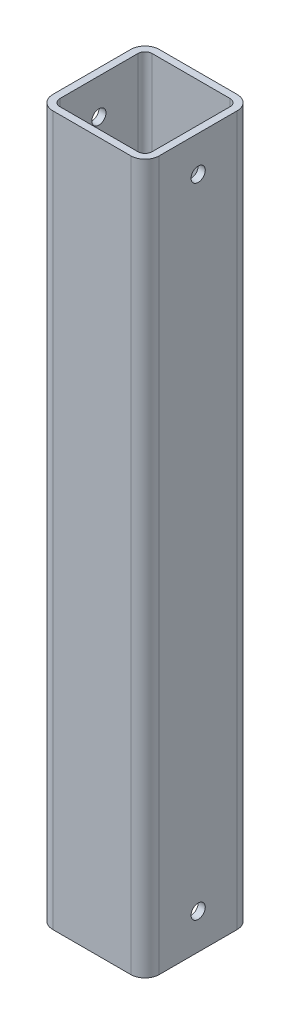
ISO-10303-21;
HEADER;
FILE_DESCRIPTION(('STEP AP214'),'2;1');
FILE_NAME('part.step','',(''),(''),'','','');
FILE_SCHEMA(('AUTOMOTIVE_DESIGN { 1 0 10303 214 1 1 1 1 }'));
ENDSEC;
DATA;
#1=APPLICATION_CONTEXT('core data for automotive mechanical design processes');
#2=APPLICATION_PROTOCOL_DEFINITION('international standard','automotive_design',2000,#1);
#3=PRODUCT_CONTEXT('',#1,'mechanical');
#4=PRODUCT('Part','Part','',(#3));
#5=PRODUCT_RELATED_PRODUCT_CATEGORY('part','',(#4));
#6=PRODUCT_DEFINITION_FORMATION('','',#4);
#7=PRODUCT_DEFINITION_CONTEXT('part definition',#1,'design');
#8=PRODUCT_DEFINITION('design','',#6,#7);
#9=PRODUCT_DEFINITION_SHAPE('','',#8);
#10=(LENGTH_UNIT() NAMED_UNIT(*) SI_UNIT(.MILLI.,.METRE.));
#11=(NAMED_UNIT(*) PLANE_ANGLE_UNIT() SI_UNIT($,.RADIAN.));
#12=(NAMED_UNIT(*) SI_UNIT($,.STERADIAN.) SOLID_ANGLE_UNIT());
#13=UNCERTAINTY_MEASURE_WITH_UNIT(LENGTH_MEASURE(1.E-05),#10,'distance_accuracy_value','');
#14=(GEOMETRIC_REPRESENTATION_CONTEXT(3) GLOBAL_UNCERTAINTY_ASSIGNED_CONTEXT((#13)) GLOBAL_UNIT_ASSIGNED_CONTEXT((#10,
#11,#12)) REPRESENTATION_CONTEXT('',''));
#15=CARTESIAN_POINT('',(0.,0.,0.));
#16=DIRECTION('',(0.,0.,1.));
#17=DIRECTION('',(1.,0.,0.));
#18=AXIS2_PLACEMENT_3D('',#15,#16,#17);
#19=CARTESIAN_POINT('',(-11.,100.,11.));
#20=DIRECTION('',(0.,-1.,0.));
#21=DIRECTION('',(0.,0.,-1.));
#22=AXIS2_PLACEMENT_3D('',#19,#20,#21);
#23=PLANE('',#22);
#24=CARTESIAN_POINT('',(-11.,100.,11.));
#25=DIRECTION('',(0.,1.,0.));
#26=DIRECTION('',(0.,0.,-1.));
#27=AXIS2_PLACEMENT_3D('',#24,#25,#26);
#28=CIRCLE('',#27,4.);
#29=CARTESIAN_POINT('',(-15.,100.,11.));
#30=VERTEX_POINT('',#29);
#31=CARTESIAN_POINT('',(-11.,100.,15.));
#32=VERTEX_POINT('',#31);
#33=EDGE_CURVE('E217',#30,#32,#28,.T.);
#34=ORIENTED_EDGE('',*,*,#33,.T.);
#35=DIRECTION('',(1.,0.,0.));
#36=VECTOR('',#35,1.);
#37=CARTESIAN_POINT('',(-11.,100.,15.));
#38=LINE('',#37,#36);
#39=CARTESIAN_POINT('',(11.,100.,15.));
#40=VERTEX_POINT('',#39);
#41=EDGE_CURVE('E220',#32,#40,#38,.T.);
#42=ORIENTED_EDGE('',*,*,#41,.T.);
#43=CARTESIAN_POINT('',(11.,100.,11.));
#44=DIRECTION('',(0.,1.,0.));
#45=DIRECTION('',(0.,0.,1.));
#46=AXIS2_PLACEMENT_3D('',#43,#44,#45);
#47=CIRCLE('',#46,4.);
#48=CARTESIAN_POINT('',(15.,100.,11.));
#49=VERTEX_POINT('',#48);
#50=EDGE_CURVE('E223',#40,#49,#47,.T.);
#51=ORIENTED_EDGE('',*,*,#50,.T.);
#52=DIRECTION('',(0.,0.,-1.));
#53=VECTOR('',#52,1.);
#54=CARTESIAN_POINT('',(15.,100.,11.));
#55=LINE('',#54,#53);
#56=CARTESIAN_POINT('',(15.,100.,-11.));
#57=VERTEX_POINT('',#56);
#58=EDGE_CURVE('E225',#49,#57,#55,.T.);
#59=ORIENTED_EDGE('',*,*,#58,.T.);
#60=CARTESIAN_POINT('',(11.,100.,-11.));
#61=DIRECTION('',(0.,1.,0.));
#62=DIRECTION('',(0.,0.,-1.));
#63=AXIS2_PLACEMENT_3D('',#60,#61,#62);
#64=CIRCLE('',#63,4.);
#65=CARTESIAN_POINT('',(11.,100.,-15.));
#66=VERTEX_POINT('',#65);
#67=EDGE_CURVE('E227',#57,#66,#64,.T.);
#68=ORIENTED_EDGE('',*,*,#67,.T.);
#69=DIRECTION('',(-1.,0.,0.));
#70=VECTOR('',#69,1.);
#71=CARTESIAN_POINT('',(-11.,100.,-15.));
#72=LINE('',#71,#70);
#73=CARTESIAN_POINT('',(-11.,100.,-15.));
#74=VERTEX_POINT('',#73);
#75=EDGE_CURVE('E229',#66,#74,#72,.T.);
#76=ORIENTED_EDGE('',*,*,#75,.T.);
#77=CARTESIAN_POINT('',(-11.,100.,-11.));
#78=DIRECTION('',(0.,1.,0.));
#79=DIRECTION('',(0.,0.,-1.));
#80=AXIS2_PLACEMENT_3D('',#77,#78,#79);
#81=CIRCLE('',#80,4.);
#82=CARTESIAN_POINT('',(-15.,100.,-11.));
#83=VERTEX_POINT('',#82);
#84=EDGE_CURVE('E231',#74,#83,#81,.T.);
#85=ORIENTED_EDGE('',*,*,#84,.T.);
#86=DIRECTION('',(0.,0.,1.));
#87=VECTOR('',#86,1.);
#88=CARTESIAN_POINT('',(-15.,100.,11.));
#89=LINE('',#88,#87);
#90=EDGE_CURVE('E233',#83,#30,#89,.T.);
#91=ORIENTED_EDGE('',*,*,#90,.T.);
#92=EDGE_LOOP('',(#34,#42,#51,#59,#68,#76,#85,#91));
#93=FACE_BOUND('',#92,.T.);
#94=CARTESIAN_POINT('',(-11.,100.,11.));
#95=DIRECTION('',(0.,1.,0.));
#96=DIRECTION('',(0.,0.,-1.));
#97=AXIS2_PLACEMENT_3D('',#94,#95,#96);
#98=CIRCLE('',#97,2.);
#99=CARTESIAN_POINT('',(-13.,100.,11.));
#100=VERTEX_POINT('',#99);
#101=CARTESIAN_POINT('',(-11.,100.,13.));
#102=VERTEX_POINT('',#101);
#103=EDGE_CURVE('E150',#100,#102,#98,.T.);
#104=ORIENTED_EDGE('',*,*,#103,.F.);
#105=DIRECTION('',(0.,0.,1.));
#106=VECTOR('',#105,1.);
#107=CARTESIAN_POINT('',(-13.,100.,11.));
#108=LINE('',#107,#106);
#109=CARTESIAN_POINT('',(-13.,100.,-11.));
#110=VERTEX_POINT('',#109);
#111=EDGE_CURVE('E184',#110,#100,#108,.T.);
#112=ORIENTED_EDGE('',*,*,#111,.F.);
#113=CARTESIAN_POINT('',(-11.,100.,-11.));
#114=DIRECTION('',(0.,1.,0.));
#115=DIRECTION('',(0.,0.,-1.));
#116=AXIS2_PLACEMENT_3D('',#113,#114,#115);
#117=CIRCLE('',#116,2.);
#118=CARTESIAN_POINT('',(-11.,100.,-13.));
#119=VERTEX_POINT('',#118);
#120=EDGE_CURVE('E182',#119,#110,#117,.T.);
#121=ORIENTED_EDGE('',*,*,#120,.F.);
#122=DIRECTION('',(-1.,0.,0.));
#123=VECTOR('',#122,1.);
#124=CARTESIAN_POINT('',(-11.,100.,-13.));
#125=LINE('',#124,#123);
#126=CARTESIAN_POINT('',(11.,100.,-13.));
#127=VERTEX_POINT('',#126);
#128=EDGE_CURVE('E180',#127,#119,#125,.T.);
#129=ORIENTED_EDGE('',*,*,#128,.F.);
#130=CARTESIAN_POINT('',(11.,100.,-11.));
#131=DIRECTION('',(0.,1.,0.));
#132=DIRECTION('',(0.,0.,-1.));
#133=AXIS2_PLACEMENT_3D('',#130,#131,#132);
#134=CIRCLE('',#133,2.);
#135=CARTESIAN_POINT('',(13.,100.,-11.));
#136=VERTEX_POINT('',#135);
#137=EDGE_CURVE('E178',#136,#127,#134,.T.);
#138=ORIENTED_EDGE('',*,*,#137,.F.);
#139=DIRECTION('',(0.,0.,-1.));
#140=VECTOR('',#139,1.);
#141=CARTESIAN_POINT('',(13.,100.,11.));
#142=LINE('',#141,#140);
#143=CARTESIAN_POINT('',(13.,100.,11.));
#144=VERTEX_POINT('',#143);
#145=EDGE_CURVE('E173',#144,#136,#142,.T.);
#146=ORIENTED_EDGE('',*,*,#145,.F.);
#147=CARTESIAN_POINT('',(11.,100.,11.));
#148=DIRECTION('',(0.,1.,0.));
#149=DIRECTION('',(0.,0.,1.));
#150=AXIS2_PLACEMENT_3D('',#147,#148,#149);
#151=CIRCLE('',#150,2.);
#152=CARTESIAN_POINT('',(11.,100.,13.));
#153=VERTEX_POINT('',#152);
#154=EDGE_CURVE('E171',#153,#144,#151,.T.);
#155=ORIENTED_EDGE('',*,*,#154,.F.);
#156=DIRECTION('',(1.,0.,0.));
#157=VECTOR('',#156,1.);
#158=CARTESIAN_POINT('',(-11.,100.,13.));
#159=LINE('',#158,#157);
#160=EDGE_CURVE('E158',#102,#153,#159,.T.);
#161=ORIENTED_EDGE('',*,*,#160,.F.);
#162=EDGE_LOOP('',(#104,#112,#121,#129,#138,#146,#155,#161));
#163=FACE_BOUND('',#162,.T.);
#164=ADVANCED_FACE('F35',(#93,#163),#23,.F.);
#165=CARTESIAN_POINT('',(-11.,-100.,11.));
#166=DIRECTION('',(0.,-1.,0.));
#167=DIRECTION('',(0.,0.,-1.));
#168=AXIS2_PLACEMENT_3D('',#165,#166,#167);
#169=PLANE('',#168);
#170=CARTESIAN_POINT('',(-11.,-100.,11.));
#171=DIRECTION('',(0.,1.,0.));
#172=DIRECTION('',(0.,0.,-1.));
#173=AXIS2_PLACEMENT_3D('',#170,#171,#172);
#174=CIRCLE('',#173,4.);
#175=CARTESIAN_POINT('',(-15.,-100.,11.));
#176=VERTEX_POINT('',#175);
#177=CARTESIAN_POINT('',(-11.,-100.,15.));
#178=VERTEX_POINT('',#177);
#179=EDGE_CURVE('E166',#176,#178,#174,.T.);
#180=ORIENTED_EDGE('',*,*,#179,.F.);
#181=DIRECTION('',(0.,0.,1.));
#182=VECTOR('',#181,1.);
#183=CARTESIAN_POINT('',(-15.,-100.,11.));
#184=LINE('',#183,#182);
#185=CARTESIAN_POINT('',(-15.,-100.,-11.));
#186=VERTEX_POINT('',#185);
#187=EDGE_CURVE('E221',#186,#176,#184,.T.);
#188=ORIENTED_EDGE('',*,*,#187,.F.);
#189=CARTESIAN_POINT('',(-11.,-100.,-11.));
#190=DIRECTION('',(0.,1.,0.));
#191=DIRECTION('',(0.,0.,-1.));
#192=AXIS2_PLACEMENT_3D('',#189,#190,#191);
#193=CIRCLE('',#192,4.);
#194=CARTESIAN_POINT('',(-11.,-100.,-15.));
#195=VERTEX_POINT('',#194);
#196=EDGE_CURVE('E248',#195,#186,#193,.T.);
#197=ORIENTED_EDGE('',*,*,#196,.F.);
#198=DIRECTION('',(-1.,0.,0.));
#199=VECTOR('',#198,1.);
#200=CARTESIAN_POINT('',(-11.,-100.,-15.));
#201=LINE('',#200,#199);
#202=CARTESIAN_POINT('',(11.,-100.,-15.));
#203=VERTEX_POINT('',#202);
#204=EDGE_CURVE('E246',#203,#195,#201,.T.);
#205=ORIENTED_EDGE('',*,*,#204,.F.);
#206=CARTESIAN_POINT('',(11.,-100.,-11.));
#207=DIRECTION('',(0.,1.,0.));
#208=DIRECTION('',(0.,0.,-1.));
#209=AXIS2_PLACEMENT_3D('',#206,#207,#208);
#210=CIRCLE('',#209,4.);
#211=CARTESIAN_POINT('',(15.,-100.,-11.));
#212=VERTEX_POINT('',#211);
#213=EDGE_CURVE('E244',#212,#203,#210,.T.);
#214=ORIENTED_EDGE('',*,*,#213,.F.);
#215=DIRECTION('',(0.,0.,-1.));
#216=VECTOR('',#215,1.);
#217=CARTESIAN_POINT('',(15.,-100.,11.));
#218=LINE('',#217,#216);
#219=CARTESIAN_POINT('',(15.,-100.,11.));
#220=VERTEX_POINT('',#219);
#221=EDGE_CURVE('E242',#220,#212,#218,.T.);
#222=ORIENTED_EDGE('',*,*,#221,.F.);
#223=CARTESIAN_POINT('',(11.,-100.,11.));
#224=DIRECTION('',(0.,1.,0.));
#225=DIRECTION('',(0.,0.,1.));
#226=AXIS2_PLACEMENT_3D('',#223,#224,#225);
#227=CIRCLE('',#226,4.);
#228=CARTESIAN_POINT('',(11.,-100.,15.));
#229=VERTEX_POINT('',#228);
#230=EDGE_CURVE('E240',#229,#220,#227,.T.);
#231=ORIENTED_EDGE('',*,*,#230,.F.);
#232=DIRECTION('',(1.,0.,0.));
#233=VECTOR('',#232,1.);
#234=CARTESIAN_POINT('',(-11.,-100.,15.));
#235=LINE('',#234,#233);
#236=EDGE_CURVE('E238',#178,#229,#235,.T.);
#237=ORIENTED_EDGE('',*,*,#236,.F.);
#238=EDGE_LOOP('',(#180,#188,#197,#205,#214,#222,#231,#237));
#239=FACE_BOUND('',#238,.T.);
#240=DIRECTION('',(0.,0.,1.));
#241=VECTOR('',#240,1.);
#242=CARTESIAN_POINT('',(-13.,-100.,11.));
#243=LINE('',#242,#241);
#244=CARTESIAN_POINT('',(-13.,-100.,-11.));
#245=VERTEX_POINT('',#244);
#246=CARTESIAN_POINT('',(-13.,-100.,11.));
#247=VERTEX_POINT('',#246);
#248=EDGE_CURVE('E159',#245,#247,#243,.T.);
#249=ORIENTED_EDGE('',*,*,#248,.T.);
#250=CARTESIAN_POINT('',(-11.,-100.,11.));
#251=DIRECTION('',(0.,1.,0.));
#252=DIRECTION('',(0.,0.,-1.));
#253=AXIS2_PLACEMENT_3D('',#250,#251,#252);
#254=CIRCLE('',#253,2.);
#255=CARTESIAN_POINT('',(-11.,-100.,13.));
#256=VERTEX_POINT('',#255);
#257=EDGE_CURVE('E60',#247,#256,#254,.T.);
#258=ORIENTED_EDGE('',*,*,#257,.T.);
#259=DIRECTION('',(1.,0.,0.));
#260=VECTOR('',#259,1.);
#261=CARTESIAN_POINT('',(-11.,-100.,13.));
#262=LINE('',#261,#260);
#263=CARTESIAN_POINT('',(11.,-100.,13.));
#264=VERTEX_POINT('',#263);
#265=EDGE_CURVE('E165',#256,#264,#262,.T.);
#266=ORIENTED_EDGE('',*,*,#265,.T.);
#267=CARTESIAN_POINT('',(11.,-100.,11.));
#268=DIRECTION('',(0.,1.,0.));
#269=DIRECTION('',(0.,0.,1.));
#270=AXIS2_PLACEMENT_3D('',#267,#268,#269);
#271=CIRCLE('',#270,2.);
#272=CARTESIAN_POINT('',(13.,-100.,11.));
#273=VERTEX_POINT('',#272);
#274=EDGE_CURVE('E189',#264,#273,#271,.T.);
#275=ORIENTED_EDGE('',*,*,#274,.T.);
#276=DIRECTION('',(0.,0.,-1.));
#277=VECTOR('',#276,1.);
#278=CARTESIAN_POINT('',(13.,-100.,11.));
#279=LINE('',#278,#277);
#280=CARTESIAN_POINT('',(13.,-100.,-11.));
#281=VERTEX_POINT('',#280);
#282=EDGE_CURVE('E192',#273,#281,#279,.T.);
#283=ORIENTED_EDGE('',*,*,#282,.T.);
#284=CARTESIAN_POINT('',(11.,-100.,-11.));
#285=DIRECTION('',(0.,1.,0.));
#286=DIRECTION('',(0.,0.,-1.));
#287=AXIS2_PLACEMENT_3D('',#284,#285,#286);
#288=CIRCLE('',#287,2.);
#289=CARTESIAN_POINT('',(11.,-100.,-13.));
#290=VERTEX_POINT('',#289);
#291=EDGE_CURVE('E195',#281,#290,#288,.T.);
#292=ORIENTED_EDGE('',*,*,#291,.T.);
#293=DIRECTION('',(-1.,0.,0.));
#294=VECTOR('',#293,1.);
#295=CARTESIAN_POINT('',(-11.,-100.,-13.));
#296=LINE('',#295,#294);
#297=CARTESIAN_POINT('',(-11.,-100.,-13.));
#298=VERTEX_POINT('',#297);
#299=EDGE_CURVE('E198',#290,#298,#296,.T.);
#300=ORIENTED_EDGE('',*,*,#299,.T.);
#301=CARTESIAN_POINT('',(-11.,-100.,-11.));
#302=DIRECTION('',(0.,1.,0.));
#303=DIRECTION('',(0.,0.,-1.));
#304=AXIS2_PLACEMENT_3D('',#301,#302,#303);
#305=CIRCLE('',#304,2.);
#306=EDGE_CURVE('E201',#298,#245,#305,.T.);
#307=ORIENTED_EDGE('',*,*,#306,.T.);
#308=EDGE_LOOP('',(#249,#258,#266,#275,#283,#292,#300,#307));
#309=FACE_BOUND('',#308,.T.);
#310=ADVANCED_FACE('F307',(#239,#309),#169,.T.);
#311=CARTESIAN_POINT('',(-11.,100.,11.));
#312=DIRECTION('',(0.,-1.,0.));
#313=DIRECTION('',(0.,0.,-1.));
#314=AXIS2_PLACEMENT_3D('',#311,#312,#313);
#315=CYLINDRICAL_SURFACE('',#314,4.);
#316=ORIENTED_EDGE('',*,*,#179,.T.);
#317=DIRECTION('',(0.,-1.,0.));
#318=VECTOR('',#317,1.);
#319=CARTESIAN_POINT('',(-11.,100.,15.));
#320=LINE('',#319,#318);
#321=EDGE_CURVE('E11',#32,#178,#320,.T.);
#322=ORIENTED_EDGE('',*,*,#321,.F.);
#323=ORIENTED_EDGE('',*,*,#33,.F.);
#324=DIRECTION('',(0.,-1.,0.));
#325=VECTOR('',#324,1.);
#326=CARTESIAN_POINT('',(-15.,100.,11.));
#327=LINE('',#326,#325);
#328=EDGE_CURVE('E235',#30,#176,#327,.T.);
#329=ORIENTED_EDGE('',*,*,#328,.T.);
#330=EDGE_LOOP('',(#316,#322,#323,#329));
#331=FACE_BOUND('',#330,.T.);
#332=ADVANCED_FACE('F37',(#331),#315,.T.);
#333=CARTESIAN_POINT('',(-11.,100.,15.));
#334=DIRECTION('',(0.,0.,-1.));
#335=DIRECTION('',(-1.,0.,0.));
#336=AXIS2_PLACEMENT_3D('',#333,#334,#335);
#337=PLANE('',#336);
#338=ORIENTED_EDGE('',*,*,#236,.T.);
#339=DIRECTION('',(0.,-1.,0.));
#340=VECTOR('',#339,1.);
#341=CARTESIAN_POINT('',(11.,100.,15.));
#342=LINE('',#341,#340);
#343=EDGE_CURVE('E44',#40,#229,#342,.T.);
#344=ORIENTED_EDGE('',*,*,#343,.F.);
#345=ORIENTED_EDGE('',*,*,#41,.F.);
#346=ORIENTED_EDGE('',*,*,#321,.T.);
#347=EDGE_LOOP('',(#338,#344,#345,#346));
#348=FACE_BOUND('',#347,.T.);
#349=ADVANCED_FACE('F369',(#348),#337,.F.);
#350=CARTESIAN_POINT('',(11.,100.,11.));
#351=DIRECTION('',(0.,-1.,0.));
#352=DIRECTION('',(0.,0.,-1.));
#353=AXIS2_PLACEMENT_3D('',#350,#351,#352);
#354=CYLINDRICAL_SURFACE('',#353,4.);
#355=ORIENTED_EDGE('',*,*,#230,.T.);
#356=DIRECTION('',(0.,-1.,0.));
#357=VECTOR('',#356,1.);
#358=CARTESIAN_POINT('',(15.,100.,11.));
#359=LINE('',#358,#357);
#360=EDGE_CURVE('E265',#49,#220,#359,.T.);
#361=ORIENTED_EDGE('',*,*,#360,.F.);
#362=ORIENTED_EDGE('',*,*,#50,.F.);
#363=ORIENTED_EDGE('',*,*,#343,.T.);
#364=EDGE_LOOP('',(#355,#361,#362,#363));
#365=FACE_BOUND('',#364,.T.);
#366=ADVANCED_FACE('F366',(#365),#354,.T.);
#367=CARTESIAN_POINT('',(15.,100.,11.));
#368=DIRECTION('',(-1.,0.,0.));
#369=DIRECTION('',(0.,0.,1.));
#370=AXIS2_PLACEMENT_3D('',#367,#368,#369);
#371=PLANE('',#370);
#372=CARTESIAN_POINT('',(15.,90.,0.));
#373=DIRECTION('',(1.,0.,0.));
#374=DIRECTION('',(0.,0.,-1.));
#375=AXIS2_PLACEMENT_3D('',#372,#373,#374);
#376=CIRCLE('',#375,2.);
#377=CARTESIAN_POINT('',(15.,90.,-2.));
#378=VERTEX_POINT('',#377);
#379=EDGE_CURVE('E278',#378,#378,#376,.T.);
#380=ORIENTED_EDGE('',*,*,#379,.F.);
#381=EDGE_LOOP('',(#380));
#382=FACE_BOUND('',#381,.T.);
#383=CARTESIAN_POINT('',(15.,-90.,0.));
#384=DIRECTION('',(1.,0.,0.));
#385=DIRECTION('',(0.,0.,1.));
#386=AXIS2_PLACEMENT_3D('',#383,#384,#385);
#387=CIRCLE('',#386,2.);
#388=CARTESIAN_POINT('',(15.,-90.,2.));
#389=VERTEX_POINT('',#388);
#390=EDGE_CURVE('E286',#389,#389,#387,.T.);
#391=ORIENTED_EDGE('',*,*,#390,.F.);
#392=EDGE_LOOP('',(#391));
#393=FACE_BOUND('',#392,.T.);
#394=ORIENTED_EDGE('',*,*,#221,.T.);
#395=DIRECTION('',(0.,-1.,0.));
#396=VECTOR('',#395,1.);
#397=CARTESIAN_POINT('',(15.,100.,-11.));
#398=LINE('',#397,#396);
#399=EDGE_CURVE('E262',#57,#212,#398,.T.);
#400=ORIENTED_EDGE('',*,*,#399,.F.);
#401=ORIENTED_EDGE('',*,*,#58,.F.);
#402=ORIENTED_EDGE('',*,*,#360,.T.);
#403=EDGE_LOOP('',(#394,#400,#401,#402));
#404=FACE_BOUND('',#403,.T.);
#405=ADVANCED_FACE('F362',(#382,#393,#404),#371,.F.);
#406=CARTESIAN_POINT('',(11.,100.,-11.));
#407=DIRECTION('',(0.,-1.,0.));
#408=DIRECTION('',(0.,0.,-1.));
#409=AXIS2_PLACEMENT_3D('',#406,#407,#408);
#410=CYLINDRICAL_SURFACE('',#409,4.);
#411=ORIENTED_EDGE('',*,*,#213,.T.);
#412=DIRECTION('',(0.,-1.,0.));
#413=VECTOR('',#412,1.);
#414=CARTESIAN_POINT('',(11.,100.,-15.));
#415=LINE('',#414,#413);
#416=EDGE_CURVE('E259',#66,#203,#415,.T.);
#417=ORIENTED_EDGE('',*,*,#416,.F.);
#418=ORIENTED_EDGE('',*,*,#67,.F.);
#419=ORIENTED_EDGE('',*,*,#399,.T.);
#420=EDGE_LOOP('',(#411,#417,#418,#419));
#421=FACE_BOUND('',#420,.T.);
#422=ADVANCED_FACE('F358',(#421),#410,.T.);
#423=CARTESIAN_POINT('',(-11.,100.,-15.));
#424=DIRECTION('',(0.,0.,1.));
#425=DIRECTION('',(1.,0.,0.));
#426=AXIS2_PLACEMENT_3D('',#423,#424,#425);
#427=PLANE('',#426);
#428=ORIENTED_EDGE('',*,*,#204,.T.);
#429=DIRECTION('',(0.,-1.,0.));
#430=VECTOR('',#429,1.);
#431=CARTESIAN_POINT('',(-11.,100.,-15.));
#432=LINE('',#431,#430);
#433=EDGE_CURVE('E256',#74,#195,#432,.T.);
#434=ORIENTED_EDGE('',*,*,#433,.F.);
#435=ORIENTED_EDGE('',*,*,#75,.F.);
#436=ORIENTED_EDGE('',*,*,#416,.T.);
#437=EDGE_LOOP('',(#428,#434,#435,#436));
#438=FACE_BOUND('',#437,.T.);
#439=ADVANCED_FACE('F354',(#438),#427,.F.);
#440=CARTESIAN_POINT('',(-11.,100.,-11.));
#441=DIRECTION('',(0.,-1.,0.));
#442=DIRECTION('',(0.,0.,-1.));
#443=AXIS2_PLACEMENT_3D('',#440,#441,#442);
#444=CYLINDRICAL_SURFACE('',#443,4.);
#445=ORIENTED_EDGE('',*,*,#196,.T.);
#446=DIRECTION('',(0.,-1.,0.));
#447=VECTOR('',#446,1.);
#448=CARTESIAN_POINT('',(-15.,100.,-11.));
#449=LINE('',#448,#447);
#450=EDGE_CURVE('E253',#83,#186,#449,.T.);
#451=ORIENTED_EDGE('',*,*,#450,.F.);
#452=ORIENTED_EDGE('',*,*,#84,.F.);
#453=ORIENTED_EDGE('',*,*,#433,.T.);
#454=EDGE_LOOP('',(#445,#451,#452,#453));
#455=FACE_BOUND('',#454,.T.);
#456=ADVANCED_FACE('F351',(#455),#444,.T.);
#457=CARTESIAN_POINT('',(-15.,100.,11.));
#458=DIRECTION('',(1.,0.,0.));
#459=DIRECTION('',(0.,0.,-1.));
#460=AXIS2_PLACEMENT_3D('',#457,#458,#459);
#461=PLANE('',#460);
#462=CARTESIAN_POINT('',(-15.,90.,0.));
#463=DIRECTION('',(1.,0.,0.));
#464=DIRECTION('',(0.,0.,-1.));
#465=AXIS2_PLACEMENT_3D('',#462,#463,#464);
#466=CIRCLE('',#465,2.);
#467=CARTESIAN_POINT('',(-15.,90.,-2.));
#468=VERTEX_POINT('',#467);
#469=EDGE_CURVE('E272',#468,#468,#466,.T.);
#470=ORIENTED_EDGE('',*,*,#469,.T.);
#471=EDGE_LOOP('',(#470));
#472=FACE_BOUND('',#471,.T.);
#473=CARTESIAN_POINT('',(-15.,-90.,0.));
#474=DIRECTION('',(1.,0.,0.));
#475=DIRECTION('',(0.,0.,1.));
#476=AXIS2_PLACEMENT_3D('',#473,#474,#475);
#477=CIRCLE('',#476,2.);
#478=CARTESIAN_POINT('',(-15.,-90.,2.));
#479=VERTEX_POINT('',#478);
#480=EDGE_CURVE('E283',#479,#479,#477,.T.);
#481=ORIENTED_EDGE('',*,*,#480,.T.);
#482=EDGE_LOOP('',(#481));
#483=FACE_BOUND('',#482,.T.);
#484=ORIENTED_EDGE('',*,*,#187,.T.);
#485=ORIENTED_EDGE('',*,*,#328,.F.);
#486=ORIENTED_EDGE('',*,*,#90,.F.);
#487=ORIENTED_EDGE('',*,*,#450,.T.);
#488=EDGE_LOOP('',(#484,#485,#486,#487));
#489=FACE_BOUND('',#488,.T.);
#490=ADVANCED_FACE('F348',(#472,#483,#489),#461,.F.);
#491=CARTESIAN_POINT('',(-11.,100.,11.));
#492=DIRECTION('',(0.,-1.,0.));
#493=DIRECTION('',(0.,0.,-1.));
#494=AXIS2_PLACEMENT_3D('',#491,#492,#493);
#495=CYLINDRICAL_SURFACE('',#494,2.);
#496=ORIENTED_EDGE('',*,*,#257,.F.);
#497=DIRECTION('',(0.,-1.,0.));
#498=VECTOR('',#497,1.);
#499=CARTESIAN_POINT('',(-13.,100.,11.));
#500=LINE('',#499,#498);
#501=EDGE_CURVE('E154',#100,#247,#500,.T.);
#502=ORIENTED_EDGE('',*,*,#501,.F.);
#503=ORIENTED_EDGE('',*,*,#103,.T.);
#504=DIRECTION('',(0.,-1.,0.));
#505=VECTOR('',#504,1.);
#506=CARTESIAN_POINT('',(-11.,100.,13.));
#507=LINE('',#506,#505);
#508=EDGE_CURVE('E153',#102,#256,#507,.T.);
#509=ORIENTED_EDGE('',*,*,#508,.T.);
#510=EDGE_LOOP('',(#496,#502,#503,#509));
#511=FACE_BOUND('',#510,.T.);
#512=ADVANCED_FACE('F152',(#511),#495,.F.);
#513=CARTESIAN_POINT('',(-11.,100.,13.));
#514=DIRECTION('',(0.,0.,-1.));
#515=DIRECTION('',(-1.,0.,0.));
#516=AXIS2_PLACEMENT_3D('',#513,#514,#515);
#517=PLANE('',#516);
#518=ORIENTED_EDGE('',*,*,#265,.F.);
#519=ORIENTED_EDGE('',*,*,#508,.F.);
#520=ORIENTED_EDGE('',*,*,#160,.T.);
#521=DIRECTION('',(0.,-1.,0.));
#522=VECTOR('',#521,1.);
#523=CARTESIAN_POINT('',(11.,100.,13.));
#524=LINE('',#523,#522);
#525=EDGE_CURVE('E167',#153,#264,#524,.T.);
#526=ORIENTED_EDGE('',*,*,#525,.T.);
#527=EDGE_LOOP('',(#518,#519,#520,#526));
#528=FACE_BOUND('',#527,.T.);
#529=ADVANCED_FACE('F162',(#528),#517,.T.);
#530=CARTESIAN_POINT('',(11.,100.,11.));
#531=DIRECTION('',(0.,-1.,0.));
#532=DIRECTION('',(0.,0.,-1.));
#533=AXIS2_PLACEMENT_3D('',#530,#531,#532);
#534=CYLINDRICAL_SURFACE('',#533,2.);
#535=ORIENTED_EDGE('',*,*,#274,.F.);
#536=ORIENTED_EDGE('',*,*,#525,.F.);
#537=ORIENTED_EDGE('',*,*,#154,.T.);
#538=DIRECTION('',(0.,-1.,0.));
#539=VECTOR('',#538,1.);
#540=CARTESIAN_POINT('',(13.,100.,11.));
#541=LINE('',#540,#539);
#542=EDGE_CURVE('E214',#144,#273,#541,.T.);
#543=ORIENTED_EDGE('',*,*,#542,.T.);
#544=EDGE_LOOP('',(#535,#536,#537,#543));
#545=FACE_BOUND('',#544,.T.);
#546=ADVANCED_FACE('F327',(#545),#534,.F.);
#547=CARTESIAN_POINT('',(13.,100.,11.));
#548=DIRECTION('',(-1.,0.,0.));
#549=DIRECTION('',(0.,0.,1.));
#550=AXIS2_PLACEMENT_3D('',#547,#548,#549);
#551=PLANE('',#550);
#552=CARTESIAN_POINT('',(13.,90.,0.));
#553=DIRECTION('',(-1.,0.,0.));
#554=DIRECTION('',(0.,0.,1.));
#555=AXIS2_PLACEMENT_3D('',#552,#553,#554);
#556=CIRCLE('',#555,2.);
#557=CARTESIAN_POINT('',(13.,90.,2.));
#558=VERTEX_POINT('',#557);
#559=EDGE_CURVE('E187',#558,#558,#556,.T.);
#560=ORIENTED_EDGE('',*,*,#559,.F.);
#561=EDGE_LOOP('',(#560));
#562=FACE_BOUND('',#561,.T.);
#563=CARTESIAN_POINT('',(13.,-90.,0.));
#564=DIRECTION('',(-1.,0.,0.));
#565=DIRECTION('',(0.,0.,1.));
#566=AXIS2_PLACEMENT_3D('',#563,#564,#565);
#567=CIRCLE('',#566,2.);
#568=CARTESIAN_POINT('',(13.,-90.,2.));
#569=VERTEX_POINT('',#568);
#570=EDGE_CURVE('E271',#569,#569,#567,.T.);
#571=ORIENTED_EDGE('',*,*,#570,.F.);
#572=EDGE_LOOP('',(#571));
#573=FACE_BOUND('',#572,.T.);
#574=ORIENTED_EDGE('',*,*,#282,.F.);
#575=ORIENTED_EDGE('',*,*,#542,.F.);
#576=ORIENTED_EDGE('',*,*,#145,.T.);
#577=DIRECTION('',(0.,-1.,0.));
#578=VECTOR('',#577,1.);
#579=CARTESIAN_POINT('',(13.,100.,-11.));
#580=LINE('',#579,#578);
#581=EDGE_CURVE('E212',#136,#281,#580,.T.);
#582=ORIENTED_EDGE('',*,*,#581,.T.);
#583=EDGE_LOOP('',(#574,#575,#576,#582));
#584=FACE_BOUND('',#583,.T.);
#585=ADVANCED_FACE('F323',(#562,#573,#584),#551,.T.);
#586=CARTESIAN_POINT('',(11.,100.,-11.));
#587=DIRECTION('',(0.,-1.,0.));
#588=DIRECTION('',(0.,0.,-1.));
#589=AXIS2_PLACEMENT_3D('',#586,#587,#588);
#590=CYLINDRICAL_SURFACE('',#589,2.);
#591=ORIENTED_EDGE('',*,*,#291,.F.);
#592=ORIENTED_EDGE('',*,*,#581,.F.);
#593=ORIENTED_EDGE('',*,*,#137,.T.);
#594=DIRECTION('',(0.,-1.,0.));
#595=VECTOR('',#594,1.);
#596=CARTESIAN_POINT('',(11.,100.,-13.));
#597=LINE('',#596,#595);
#598=EDGE_CURVE('E210',#127,#290,#597,.T.);
#599=ORIENTED_EDGE('',*,*,#598,.T.);
#600=EDGE_LOOP('',(#591,#592,#593,#599));
#601=FACE_BOUND('',#600,.T.);
#602=ADVANCED_FACE('F319',(#601),#590,.F.);
#603=CARTESIAN_POINT('',(-11.,100.,-13.));
#604=DIRECTION('',(0.,0.,1.));
#605=DIRECTION('',(1.,0.,0.));
#606=AXIS2_PLACEMENT_3D('',#603,#604,#605);
#607=PLANE('',#606);
#608=ORIENTED_EDGE('',*,*,#299,.F.);
#609=ORIENTED_EDGE('',*,*,#598,.F.);
#610=ORIENTED_EDGE('',*,*,#128,.T.);
#611=DIRECTION('',(0.,-1.,0.));
#612=VECTOR('',#611,1.);
#613=CARTESIAN_POINT('',(-11.,100.,-13.));
#614=LINE('',#613,#612);
#615=EDGE_CURVE('E208',#119,#298,#614,.T.);
#616=ORIENTED_EDGE('',*,*,#615,.T.);
#617=EDGE_LOOP('',(#608,#609,#610,#616));
#618=FACE_BOUND('',#617,.T.);
#619=ADVANCED_FACE('F316',(#618),#607,.T.);
#620=CARTESIAN_POINT('',(-11.,100.,-11.));
#621=DIRECTION('',(0.,-1.,0.));
#622=DIRECTION('',(0.,0.,-1.));
#623=AXIS2_PLACEMENT_3D('',#620,#621,#622);
#624=CYLINDRICAL_SURFACE('',#623,2.);
#625=ORIENTED_EDGE('',*,*,#306,.F.);
#626=ORIENTED_EDGE('',*,*,#615,.F.);
#627=ORIENTED_EDGE('',*,*,#120,.T.);
#628=DIRECTION('',(0.,-1.,0.));
#629=VECTOR('',#628,1.);
#630=CARTESIAN_POINT('',(-13.,100.,-11.));
#631=LINE('',#630,#629);
#632=EDGE_CURVE('E52',#110,#245,#631,.T.);
#633=ORIENTED_EDGE('',*,*,#632,.T.);
#634=EDGE_LOOP('',(#625,#626,#627,#633));
#635=FACE_BOUND('',#634,.T.);
#636=ADVANCED_FACE('F303',(#635),#624,.F.);
#637=CARTESIAN_POINT('',(-13.,100.,11.));
#638=DIRECTION('',(1.,0.,0.));
#639=DIRECTION('',(0.,0.,-1.));
#640=AXIS2_PLACEMENT_3D('',#637,#638,#639);
#641=PLANE('',#640);
#642=CARTESIAN_POINT('',(-13.,90.,0.));
#643=DIRECTION('',(1.,0.,0.));
#644=DIRECTION('',(0.,0.,-1.));
#645=AXIS2_PLACEMENT_3D('',#642,#643,#644);
#646=CIRCLE('',#645,2.);
#647=CARTESIAN_POINT('',(-13.,90.,-2.));
#648=VERTEX_POINT('',#647);
#649=EDGE_CURVE('E39',#648,#648,#646,.T.);
#650=ORIENTED_EDGE('',*,*,#649,.F.);
#651=EDGE_LOOP('',(#650));
#652=FACE_BOUND('',#651,.T.);
#653=CARTESIAN_POINT('',(-13.,-90.,0.));
#654=DIRECTION('',(1.,0.,0.));
#655=DIRECTION('',(0.,0.,-1.));
#656=AXIS2_PLACEMENT_3D('',#653,#654,#655);
#657=CIRCLE('',#656,2.);
#658=CARTESIAN_POINT('',(-13.,-90.,-2.));
#659=VERTEX_POINT('',#658);
#660=EDGE_CURVE('E269',#659,#659,#657,.T.);
#661=ORIENTED_EDGE('',*,*,#660,.F.);
#662=EDGE_LOOP('',(#661));
#663=FACE_BOUND('',#662,.T.);
#664=ORIENTED_EDGE('',*,*,#248,.F.);
#665=ORIENTED_EDGE('',*,*,#632,.F.);
#666=ORIENTED_EDGE('',*,*,#111,.T.);
#667=ORIENTED_EDGE('',*,*,#501,.T.);
#668=EDGE_LOOP('',(#664,#665,#666,#667));
#669=FACE_BOUND('',#668,.T.);
#670=ADVANCED_FACE('F299',(#652,#663,#669),#641,.T.);
#671=CARTESIAN_POINT('',(-15.,-90.,0.));
#672=DIRECTION('',(1.,0.,0.));
#673=DIRECTION('',(0.,0.,-1.));
#674=AXIS2_PLACEMENT_3D('',#671,#672,#673);
#675=CYLINDRICAL_SURFACE('',#674,2.);
#676=ORIENTED_EDGE('',*,*,#660,.T.);
#677=EDGE_LOOP('',(#676));
#678=FACE_BOUND('',#677,.T.);
#679=ORIENTED_EDGE('',*,*,#480,.F.);
#680=EDGE_LOOP('',(#679));
#681=FACE_BOUND('',#680,.T.);
#682=ADVANCED_FACE('F302',(#678,#681),#675,.F.);
#683=CARTESIAN_POINT('',(-15.,90.,0.));
#684=DIRECTION('',(1.,0.,0.));
#685=DIRECTION('',(0.,0.,-1.));
#686=AXIS2_PLACEMENT_3D('',#683,#684,#685);
#687=CYLINDRICAL_SURFACE('',#686,2.);
#688=ORIENTED_EDGE('',*,*,#649,.T.);
#689=EDGE_LOOP('',(#688));
#690=FACE_BOUND('',#689,.T.);
#691=ORIENTED_EDGE('',*,*,#469,.F.);
#692=EDGE_LOOP('',(#691));
#693=FACE_BOUND('',#692,.T.);
#694=ADVANCED_FACE('F296',(#690,#693),#687,.F.);
#695=ORIENTED_EDGE('',*,*,#570,.T.);
#696=EDGE_LOOP('',(#695));
#697=FACE_BOUND('',#696,.T.);
#698=ORIENTED_EDGE('',*,*,#390,.T.);
#699=EDGE_LOOP('',(#698));
#700=FACE_BOUND('',#699,.T.);
#701=ADVANCED_FACE('F503',(#697,#700),#675,.F.);
#702=ORIENTED_EDGE('',*,*,#559,.T.);
#703=EDGE_LOOP('',(#702));
#704=FACE_BOUND('',#703,.T.);
#705=ORIENTED_EDGE('',*,*,#379,.T.);
#706=EDGE_LOOP('',(#705));
#707=FACE_BOUND('',#706,.T.);
#708=ADVANCED_FACE('F511',(#704,#707),#687,.F.);
#709=CLOSED_SHELL('',(#164,#310,#332,#349,#366,#405,#422,#439,#456,#490,#512,#529,#546,#585,
#602,#619,#636,#670,#682,#694,#701,#708));
#710=MANIFOLD_SOLID_BREP('B2',#709);
#711=ADVANCED_BREP_SHAPE_REPRESENTATION('',(#18,#710),#14);
#712=SHAPE_DEFINITION_REPRESENTATION(#9,#711);
ENDSEC;
END-ISO-10303-21;
